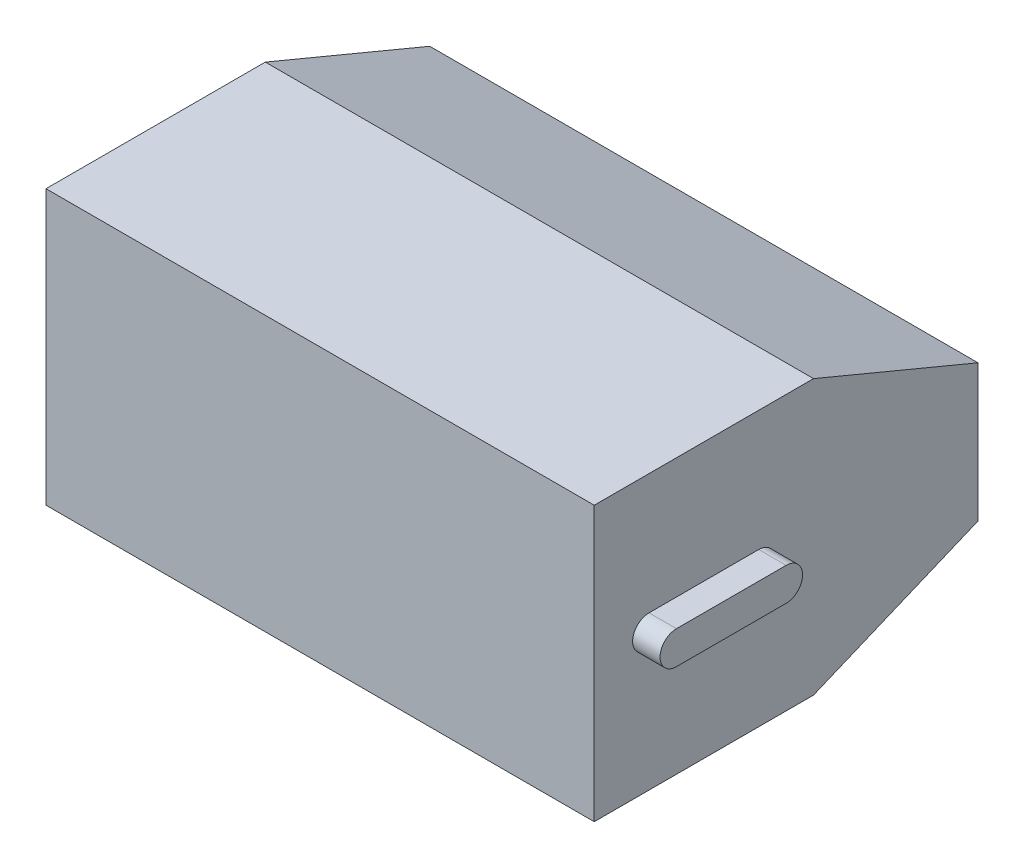
ISO-10303-21;
HEADER;
FILE_DESCRIPTION(('STEP AP214'),'2;1');
FILE_NAME('part.step','',(''),(''),'','','');
FILE_SCHEMA(('AUTOMOTIVE_DESIGN { 1 0 10303 214 1 1 1 1 }'));
ENDSEC;
DATA;
#1=APPLICATION_CONTEXT('core data for automotive mechanical design processes');
#2=APPLICATION_PROTOCOL_DEFINITION('international standard','automotive_design',2000,#1);
#3=PRODUCT_CONTEXT('',#1,'mechanical');
#4=PRODUCT('Part','Part','',(#3));
#5=PRODUCT_RELATED_PRODUCT_CATEGORY('part','',(#4));
#6=PRODUCT_DEFINITION_FORMATION('','',#4);
#7=PRODUCT_DEFINITION_CONTEXT('part definition',#1,'design');
#8=PRODUCT_DEFINITION('design','',#6,#7);
#9=PRODUCT_DEFINITION_SHAPE('','',#8);
#10=(LENGTH_UNIT() NAMED_UNIT(*) SI_UNIT(.MILLI.,.METRE.));
#11=(NAMED_UNIT(*) PLANE_ANGLE_UNIT() SI_UNIT($,.RADIAN.));
#12=(NAMED_UNIT(*) SI_UNIT($,.STERADIAN.) SOLID_ANGLE_UNIT());
#13=UNCERTAINTY_MEASURE_WITH_UNIT(LENGTH_MEASURE(1.E-05),#10,'distance_accuracy_value','');
#14=(GEOMETRIC_REPRESENTATION_CONTEXT(3) GLOBAL_UNCERTAINTY_ASSIGNED_CONTEXT((#13)) GLOBAL_UNIT_ASSIGNED_CONTEXT((#10,
#11,#12)) REPRESENTATION_CONTEXT('',''));
#15=CARTESIAN_POINT('',(0.,0.,0.));
#16=DIRECTION('',(0.,0.,1.));
#17=DIRECTION('',(1.,0.,0.));
#18=AXIS2_PLACEMENT_3D('',#15,#16,#17);
#19=CARTESIAN_POINT('',(50.,0.,0.));
#20=DIRECTION('',(1.,0.,0.));
#21=DIRECTION('',(0.,0.,-1.));
#22=AXIS2_PLACEMENT_3D('',#19,#20,#21);
#23=PLANE('',#22);
#24=DIRECTION('',(0.,0.384615384615389,-0.923076923076921));
#25=VECTOR('',#24,1.);
#26=CARTESIAN_POINT('',(50.,181.022440667378,177.070290746831));
#27=LINE('',#26,#25);
#28=CARTESIAN_POINT('',(50.,181.022440667378,177.070290746831));
#29=VERTEX_POINT('',#28);
#30=CARTESIAN_POINT('',(50.,193.522440667378,147.070290746831));
#31=VERTEX_POINT('',#30);
#32=EDGE_CURVE('E207',#29,#31,#27,.T.);
#33=ORIENTED_EDGE('',*,*,#32,.T.);
#34=DIRECTION('',(0.,1.,0.));
#35=VECTOR('',#34,1.);
#36=CARTESIAN_POINT('',(50.,193.522440667378,147.070290746831));
#37=LINE('',#36,#35);
#38=CARTESIAN_POINT('',(50.,218.522440667378,147.070290746831));
#39=VERTEX_POINT('',#38);
#40=EDGE_CURVE('E210',#31,#39,#37,.T.);
#41=ORIENTED_EDGE('',*,*,#40,.T.);
#42=DIRECTION('',(0.,0.384615384615377,0.923076923076926));
#43=VECTOR('',#42,1.);
#44=CARTESIAN_POINT('',(50.,218.522440667378,147.070290746831));
#45=LINE('',#44,#43);
#46=CARTESIAN_POINT('',(50.,231.022440667378,177.070290746831));
#47=VERTEX_POINT('',#46);
#48=EDGE_CURVE('E213',#39,#47,#45,.T.);
#49=ORIENTED_EDGE('',*,*,#48,.T.);
#50=DIRECTION('',(0.,0.,1.));
#51=VECTOR('',#50,1.);
#52=CARTESIAN_POINT('',(50.,231.022440667378,217.070290746831));
#53=LINE('',#52,#51);
#54=CARTESIAN_POINT('',(50.,231.022440667378,217.070290746831));
#55=VERTEX_POINT('',#54);
#56=EDGE_CURVE('E216',#47,#55,#53,.T.);
#57=ORIENTED_EDGE('',*,*,#56,.T.);
#58=DIRECTION('',(0.,-1.,0.));
#59=VECTOR('',#58,1.);
#60=CARTESIAN_POINT('',(50.,231.022440667378,217.070290746831));
#61=LINE('',#60,#59);
#62=CARTESIAN_POINT('',(50.,181.022440667378,217.070290746831));
#63=VERTEX_POINT('',#62);
#64=EDGE_CURVE('E219',#55,#63,#61,.T.);
#65=ORIENTED_EDGE('',*,*,#64,.T.);
#66=DIRECTION('',(0.,0.,-1.));
#67=VECTOR('',#66,1.);
#68=CARTESIAN_POINT('',(50.,181.022440667378,217.070290746831));
#69=LINE('',#68,#67);
#70=EDGE_CURVE('E222',#63,#29,#69,.T.);
#71=ORIENTED_EDGE('',*,*,#70,.T.);
#72=EDGE_LOOP('',(#33,#41,#49,#57,#65,#71));
#73=FACE_BOUND('',#72,.T.);
#74=DIRECTION('',(0.,0.,1.));
#75=VECTOR('',#74,1.);
#76=CARTESIAN_POINT('',(50.,203.022440667378,0.));
#77=LINE('',#76,#75);
#78=CARTESIAN_POINT('',(50.,203.022440667378,187.070290746831));
#79=VERTEX_POINT('',#78);
#80=CARTESIAN_POINT('',(50.,203.022440667378,207.070290746831));
#81=VERTEX_POINT('',#80);
#82=EDGE_CURVE('E60',#79,#81,#77,.T.);
#83=ORIENTED_EDGE('',*,*,#82,.T.);
#84=CARTESIAN_POINT('',(50.,206.022440667378,207.070290746831));
#85=DIRECTION('',(1.,0.,0.));
#86=DIRECTION('',(0.,0.,-1.));
#87=AXIS2_PLACEMENT_3D('',#84,#85,#86);
#88=CIRCLE('',#87,3.);
#89=CARTESIAN_POINT('',(50.,209.022440667378,207.070290746831));
#90=VERTEX_POINT('',#89);
#91=EDGE_CURVE('E174',#90,#81,#88,.T.);
#92=ORIENTED_EDGE('',*,*,#91,.F.);
#93=DIRECTION('',(0.,0.,-1.));
#94=VECTOR('',#93,1.);
#95=CARTESIAN_POINT('',(50.,209.022440667378,0.));
#96=LINE('',#95,#94);
#97=CARTESIAN_POINT('',(50.,209.022440667378,187.070290746831));
#98=VERTEX_POINT('',#97);
#99=EDGE_CURVE('E181',#90,#98,#96,.T.);
#100=ORIENTED_EDGE('',*,*,#99,.T.);
#101=CARTESIAN_POINT('',(50.,206.022440667378,187.070290746831));
#102=DIRECTION('',(1.,0.,0.));
#103=DIRECTION('',(0.,0.,-1.));
#104=AXIS2_PLACEMENT_3D('',#101,#102,#103);
#105=CIRCLE('',#104,3.);
#106=EDGE_CURVE('E193',#79,#98,#105,.T.);
#107=ORIENTED_EDGE('',*,*,#106,.F.);
#108=EDGE_LOOP('',(#83,#92,#100,#107));
#109=FACE_BOUND('',#108,.T.);
#110=ADVANCED_FACE('F35',(#73,#109),#23,.T.);
#111=CARTESIAN_POINT('',(-50.,181.022440667378,177.070290746831));
#112=DIRECTION('',(0.,-0.923076923076921,-0.384615384615389));
#113=DIRECTION('',(0.,0.384615384615389,-0.923076923076921));
#114=AXIS2_PLACEMENT_3D('',#111,#112,#113);
#115=PLANE('',#114);
#116=DIRECTION('',(1.,0.,0.));
#117=VECTOR('',#116,1.);
#118=CARTESIAN_POINT('',(-50.,193.522440667378,147.070290746831));
#119=LINE('',#118,#117);
#120=CARTESIAN_POINT('',(-50.,193.522440667378,147.070290746831));
#121=VERTEX_POINT('',#120);
#122=EDGE_CURVE('E39',#121,#31,#119,.T.);
#123=ORIENTED_EDGE('',*,*,#122,.T.);
#124=ORIENTED_EDGE('',*,*,#32,.F.);
#125=DIRECTION('',(1.,0.,0.));
#126=VECTOR('',#125,1.);
#127=CARTESIAN_POINT('',(-50.,181.022440667378,177.070290746831));
#128=LINE('',#127,#126);
#129=CARTESIAN_POINT('',(-50.,181.022440667378,177.070290746831));
#130=VERTEX_POINT('',#129);
#131=EDGE_CURVE('E11',#130,#29,#128,.T.);
#132=ORIENTED_EDGE('',*,*,#131,.F.);
#133=DIRECTION('',(0.,0.384615384615389,-0.923076923076921));
#134=VECTOR('',#133,1.);
#135=CARTESIAN_POINT('',(-50.,181.022440667378,177.070290746831));
#136=LINE('',#135,#134);
#137=EDGE_CURVE('E225',#130,#121,#136,.T.);
#138=ORIENTED_EDGE('',*,*,#137,.T.);
#139=EDGE_LOOP('',(#123,#124,#132,#138));
#140=FACE_BOUND('',#139,.T.);
#141=ADVANCED_FACE('F37',(#140),#115,.T.);
#142=CARTESIAN_POINT('',(-50.,181.022440667378,217.070290746831));
#143=DIRECTION('',(0.,-1.,0.));
#144=DIRECTION('',(0.,0.,-1.));
#145=AXIS2_PLACEMENT_3D('',#142,#143,#144);
#146=PLANE('',#145);
#147=ORIENTED_EDGE('',*,*,#131,.T.);
#148=ORIENTED_EDGE('',*,*,#70,.F.);
#149=DIRECTION('',(1.,0.,0.));
#150=VECTOR('',#149,1.);
#151=CARTESIAN_POINT('',(-50.,181.022440667378,217.070290746831));
#152=LINE('',#151,#150);
#153=CARTESIAN_POINT('',(-50.,181.022440667378,217.070290746831));
#154=VERTEX_POINT('',#153);
#155=EDGE_CURVE('E44',#154,#63,#152,.T.);
#156=ORIENTED_EDGE('',*,*,#155,.F.);
#157=DIRECTION('',(0.,0.,-1.));
#158=VECTOR('',#157,1.);
#159=CARTESIAN_POINT('',(-50.,181.022440667378,217.070290746831));
#160=LINE('',#159,#158);
#161=EDGE_CURVE('E240',#154,#130,#160,.T.);
#162=ORIENTED_EDGE('',*,*,#161,.T.);
#163=EDGE_LOOP('',(#147,#148,#156,#162));
#164=FACE_BOUND('',#163,.T.);
#165=ADVANCED_FACE('F260',(#164),#146,.T.);
#166=CARTESIAN_POINT('',(-50.,231.022440667378,217.070290746831));
#167=DIRECTION('',(0.,0.,1.));
#168=DIRECTION('',(1.,0.,0.));
#169=AXIS2_PLACEMENT_3D('',#166,#167,#168);
#170=PLANE('',#169);
#171=ORIENTED_EDGE('',*,*,#155,.T.);
#172=ORIENTED_EDGE('',*,*,#64,.F.);
#173=DIRECTION('',(1.,0.,0.));
#174=VECTOR('',#173,1.);
#175=CARTESIAN_POINT('',(-50.,231.022440667378,217.070290746831));
#176=LINE('',#175,#174);
#177=CARTESIAN_POINT('',(-50.,231.022440667378,217.070290746831));
#178=VERTEX_POINT('',#177);
#179=EDGE_CURVE('E244',#178,#55,#176,.T.);
#180=ORIENTED_EDGE('',*,*,#179,.F.);
#181=DIRECTION('',(0.,-1.,0.));
#182=VECTOR('',#181,1.);
#183=CARTESIAN_POINT('',(-50.,231.022440667378,217.070290746831));
#184=LINE('',#183,#182);
#185=EDGE_CURVE('E237',#178,#154,#184,.T.);
#186=ORIENTED_EDGE('',*,*,#185,.T.);
#187=EDGE_LOOP('',(#171,#172,#180,#186));
#188=FACE_BOUND('',#187,.T.);
#189=ADVANCED_FACE('F273',(#188),#170,.T.);
#190=CARTESIAN_POINT('',(-50.,231.022440667378,217.070290746831));
#191=DIRECTION('',(0.,1.,0.));
#192=DIRECTION('',(0.,0.,1.));
#193=AXIS2_PLACEMENT_3D('',#190,#191,#192);
#194=PLANE('',#193);
#195=ORIENTED_EDGE('',*,*,#179,.T.);
#196=ORIENTED_EDGE('',*,*,#56,.F.);
#197=DIRECTION('',(1.,0.,0.));
#198=VECTOR('',#197,1.);
#199=CARTESIAN_POINT('',(-50.,231.022440667378,177.070290746831));
#200=LINE('',#199,#198);
#201=CARTESIAN_POINT('',(-50.,231.022440667378,177.070290746831));
#202=VERTEX_POINT('',#201);
#203=EDGE_CURVE('E246',#202,#47,#200,.T.);
#204=ORIENTED_EDGE('',*,*,#203,.F.);
#205=DIRECTION('',(0.,0.,1.));
#206=VECTOR('',#205,1.);
#207=CARTESIAN_POINT('',(-50.,231.022440667378,217.070290746831));
#208=LINE('',#207,#206);
#209=EDGE_CURVE('E234',#202,#178,#208,.T.);
#210=ORIENTED_EDGE('',*,*,#209,.T.);
#211=EDGE_LOOP('',(#195,#196,#204,#210));
#212=FACE_BOUND('',#211,.T.);
#213=ADVANCED_FACE('F271',(#212),#194,.T.);
#214=CARTESIAN_POINT('',(-50.,218.522440667378,147.070290746831));
#215=DIRECTION('',(0.,0.923076923076926,-0.384615384615377));
#216=DIRECTION('',(0.,0.384615384615377,0.923076923076926));
#217=AXIS2_PLACEMENT_3D('',#214,#215,#216);
#218=PLANE('',#217);
#219=ORIENTED_EDGE('',*,*,#203,.T.);
#220=ORIENTED_EDGE('',*,*,#48,.F.);
#221=DIRECTION('',(1.,0.,0.));
#222=VECTOR('',#221,1.);
#223=CARTESIAN_POINT('',(-50.,218.522440667378,147.070290746831));
#224=LINE('',#223,#222);
#225=CARTESIAN_POINT('',(-50.,218.522440667378,147.070290746831));
#226=VERTEX_POINT('',#225);
#227=EDGE_CURVE('E247',#226,#39,#224,.T.);
#228=ORIENTED_EDGE('',*,*,#227,.F.);
#229=DIRECTION('',(0.,0.384615384615377,0.923076923076926));
#230=VECTOR('',#229,1.);
#231=CARTESIAN_POINT('',(-50.,218.522440667378,147.070290746831));
#232=LINE('',#231,#230);
#233=EDGE_CURVE('E231',#226,#202,#232,.T.);
#234=ORIENTED_EDGE('',*,*,#233,.T.);
#235=EDGE_LOOP('',(#219,#220,#228,#234));
#236=FACE_BOUND('',#235,.T.);
#237=ADVANCED_FACE('F268',(#236),#218,.T.);
#238=CARTESIAN_POINT('',(-50.,193.522440667378,147.070290746831));
#239=DIRECTION('',(0.,0.,-1.));
#240=DIRECTION('',(-1.,0.,0.));
#241=AXIS2_PLACEMENT_3D('',#238,#239,#240);
#242=PLANE('',#241);
#243=ORIENTED_EDGE('',*,*,#227,.T.);
#244=ORIENTED_EDGE('',*,*,#40,.F.);
#245=ORIENTED_EDGE('',*,*,#122,.F.);
#246=DIRECTION('',(0.,1.,0.));
#247=VECTOR('',#246,1.);
#248=CARTESIAN_POINT('',(-50.,193.522440667378,147.070290746831));
#249=LINE('',#248,#247);
#250=EDGE_CURVE('E228',#121,#226,#249,.T.);
#251=ORIENTED_EDGE('',*,*,#250,.T.);
#252=EDGE_LOOP('',(#243,#244,#245,#251));
#253=FACE_BOUND('',#252,.T.);
#254=ADVANCED_FACE('F254',(#253),#242,.T.);
#255=CARTESIAN_POINT('',(-50.,0.,0.));
#256=DIRECTION('',(1.,0.,0.));
#257=DIRECTION('',(0.,0.,-1.));
#258=AXIS2_PLACEMENT_3D('',#255,#256,#257);
#259=PLANE('',#258);
#260=CARTESIAN_POINT('',(-50.,206.022440667378,207.070290746831));
#261=DIRECTION('',(1.,0.,0.));
#262=DIRECTION('',(0.,0.,-1.));
#263=AXIS2_PLACEMENT_3D('',#260,#261,#262);
#264=CIRCLE('',#263,3.);
#265=CARTESIAN_POINT('',(-50.,209.022440667378,207.070290746831));
#266=VERTEX_POINT('',#265);
#267=CARTESIAN_POINT('',(-50.,203.022440667378,207.070290746831));
#268=VERTEX_POINT('',#267);
#269=EDGE_CURVE('E162',#266,#268,#264,.T.);
#270=ORIENTED_EDGE('',*,*,#269,.T.);
#271=DIRECTION('',(0.,0.,-1.));
#272=VECTOR('',#271,1.);
#273=CARTESIAN_POINT('',(-50.,203.022440667378,0.));
#274=LINE('',#273,#272);
#275=CARTESIAN_POINT('',(-50.,203.022440667378,187.070290746831));
#276=VERTEX_POINT('',#275);
#277=EDGE_CURVE('E169',#268,#276,#274,.T.);
#278=ORIENTED_EDGE('',*,*,#277,.T.);
#279=CARTESIAN_POINT('',(-50.,206.022440667378,187.070290746831));
#280=DIRECTION('',(1.,0.,0.));
#281=DIRECTION('',(0.,0.,-1.));
#282=AXIS2_PLACEMENT_3D('',#279,#280,#281);
#283=CIRCLE('',#282,3.);
#284=CARTESIAN_POINT('',(-50.,209.022440667378,187.070290746831));
#285=VERTEX_POINT('',#284);
#286=EDGE_CURVE('E142',#276,#285,#283,.T.);
#287=ORIENTED_EDGE('',*,*,#286,.T.);
#288=DIRECTION('',(0.,0.,1.));
#289=VECTOR('',#288,1.);
#290=CARTESIAN_POINT('',(-50.,209.022440667378,0.));
#291=LINE('',#290,#289);
#292=EDGE_CURVE('E52',#285,#266,#291,.T.);
#293=ORIENTED_EDGE('',*,*,#292,.T.);
#294=EDGE_LOOP('',(#270,#278,#287,#293));
#295=FACE_BOUND('',#294,.T.);
#296=ORIENTED_EDGE('',*,*,#137,.F.);
#297=ORIENTED_EDGE('',*,*,#161,.F.);
#298=ORIENTED_EDGE('',*,*,#185,.F.);
#299=ORIENTED_EDGE('',*,*,#209,.F.);
#300=ORIENTED_EDGE('',*,*,#233,.F.);
#301=ORIENTED_EDGE('',*,*,#250,.F.);
#302=EDGE_LOOP('',(#296,#297,#298,#299,#300,#301));
#303=FACE_BOUND('',#302,.T.);
#304=ADVANCED_FACE('F263',(#295,#303),#259,.F.);
#305=CARTESIAN_POINT('',(55.,206.022440667378,207.070290746831));
#306=DIRECTION('',(-1.,0.,0.));
#307=DIRECTION('',(0.,0.,1.));
#308=AXIS2_PLACEMENT_3D('',#305,#306,#307);
#309=CYLINDRICAL_SURFACE('',#308,3.);
#310=ORIENTED_EDGE('',*,*,#91,.T.);
#311=DIRECTION('',(-1.,0.,0.));
#312=VECTOR('',#311,1.);
#313=CARTESIAN_POINT('',(55.,203.022440667378,207.070290746831));
#314=LINE('',#313,#312);
#315=CARTESIAN_POINT('',(55.,203.022440667378,207.070290746831));
#316=VERTEX_POINT('',#315);
#317=EDGE_CURVE('E205',#316,#81,#314,.T.);
#318=ORIENTED_EDGE('',*,*,#317,.F.);
#319=CARTESIAN_POINT('',(55.,206.022440667378,207.070290746831));
#320=DIRECTION('',(1.,0.,0.));
#321=DIRECTION('',(0.,0.,-1.));
#322=AXIS2_PLACEMENT_3D('',#319,#320,#321);
#323=CIRCLE('',#322,3.);
#324=CARTESIAN_POINT('',(55.,209.022440667378,207.070290746831));
#325=VERTEX_POINT('',#324);
#326=EDGE_CURVE('E178',#325,#316,#323,.T.);
#327=ORIENTED_EDGE('',*,*,#326,.F.);
#328=DIRECTION('',(-1.,0.,0.));
#329=VECTOR('',#328,1.);
#330=CARTESIAN_POINT('',(55.,209.022440667378,207.070290746831));
#331=LINE('',#330,#329);
#332=EDGE_CURVE('E189',#325,#90,#331,.T.);
#333=ORIENTED_EDGE('',*,*,#332,.T.);
#334=EDGE_LOOP('',(#310,#318,#327,#333));
#335=FACE_BOUND('',#334,.T.);
#336=ADVANCED_FACE('F289',(#335),#309,.T.);
#337=CARTESIAN_POINT('',(55.,203.022440667378,0.));
#338=DIRECTION('',(0.,-1.,0.));
#339=DIRECTION('',(0.,0.,-1.));
#340=AXIS2_PLACEMENT_3D('',#337,#338,#339);
#341=PLANE('',#340);
#342=ORIENTED_EDGE('',*,*,#82,.F.);
#343=DIRECTION('',(-1.,0.,0.));
#344=VECTOR('',#343,1.);
#345=CARTESIAN_POINT('',(55.,203.022440667378,187.070290746831));
#346=LINE('',#345,#344);
#347=CARTESIAN_POINT('',(55.,203.022440667378,187.070290746831));
#348=VERTEX_POINT('',#347);
#349=EDGE_CURVE('E202',#348,#79,#346,.T.);
#350=ORIENTED_EDGE('',*,*,#349,.F.);
#351=DIRECTION('',(0.,0.,1.));
#352=VECTOR('',#351,1.);
#353=CARTESIAN_POINT('',(55.,203.022440667378,0.));
#354=LINE('',#353,#352);
#355=EDGE_CURVE('E180',#348,#316,#354,.T.);
#356=ORIENTED_EDGE('',*,*,#355,.T.);
#357=ORIENTED_EDGE('',*,*,#317,.T.);
#358=EDGE_LOOP('',(#342,#350,#356,#357));
#359=FACE_BOUND('',#358,.T.);
#360=ADVANCED_FACE('F297',(#359),#341,.T.);
#361=CARTESIAN_POINT('',(55.,206.022440667378,187.070290746831));
#362=DIRECTION('',(-1.,0.,0.));
#363=DIRECTION('',(0.,0.,1.));
#364=AXIS2_PLACEMENT_3D('',#361,#362,#363);
#365=CYLINDRICAL_SURFACE('',#364,3.);
#366=ORIENTED_EDGE('',*,*,#106,.T.);
#367=DIRECTION('',(-1.,0.,0.));
#368=VECTOR('',#367,1.);
#369=CARTESIAN_POINT('',(55.,209.022440667378,187.070290746831));
#370=LINE('',#369,#368);
#371=CARTESIAN_POINT('',(55.,209.022440667378,187.070290746831));
#372=VERTEX_POINT('',#371);
#373=EDGE_CURVE('E199',#372,#98,#370,.T.);
#374=ORIENTED_EDGE('',*,*,#373,.F.);
#375=CARTESIAN_POINT('',(55.,206.022440667378,187.070290746831));
#376=DIRECTION('',(1.,0.,0.));
#377=DIRECTION('',(0.,0.,-1.));
#378=AXIS2_PLACEMENT_3D('',#375,#376,#377);
#379=CIRCLE('',#378,3.);
#380=EDGE_CURVE('E184',#348,#372,#379,.T.);
#381=ORIENTED_EDGE('',*,*,#380,.F.);
#382=ORIENTED_EDGE('',*,*,#349,.T.);
#383=EDGE_LOOP('',(#366,#374,#381,#382));
#384=FACE_BOUND('',#383,.T.);
#385=ADVANCED_FACE('F322',(#384),#365,.T.);
#386=CARTESIAN_POINT('',(55.,209.022440667378,0.));
#387=DIRECTION('',(0.,1.,0.));
#388=DIRECTION('',(0.,0.,1.));
#389=AXIS2_PLACEMENT_3D('',#386,#387,#388);
#390=PLANE('',#389);
#391=ORIENTED_EDGE('',*,*,#99,.F.);
#392=ORIENTED_EDGE('',*,*,#332,.F.);
#393=DIRECTION('',(0.,0.,-1.));
#394=VECTOR('',#393,1.);
#395=CARTESIAN_POINT('',(55.,209.022440667378,0.));
#396=LINE('',#395,#394);
#397=EDGE_CURVE('E186',#325,#372,#396,.T.);
#398=ORIENTED_EDGE('',*,*,#397,.T.);
#399=ORIENTED_EDGE('',*,*,#373,.T.);
#400=EDGE_LOOP('',(#391,#392,#398,#399));
#401=FACE_BOUND('',#400,.T.);
#402=ADVANCED_FACE('F318',(#401),#390,.T.);
#403=CARTESIAN_POINT('',(55.,206.022440667378,207.070290746831));
#404=DIRECTION('',(1.,0.,0.));
#405=DIRECTION('',(0.,0.,-1.));
#406=AXIS2_PLACEMENT_3D('',#403,#404,#405);
#407=PLANE('',#406);
#408=ORIENTED_EDGE('',*,*,#326,.T.);
#409=ORIENTED_EDGE('',*,*,#355,.F.);
#410=ORIENTED_EDGE('',*,*,#380,.T.);
#411=ORIENTED_EDGE('',*,*,#397,.F.);
#412=EDGE_LOOP('',(#408,#409,#410,#411));
#413=FACE_BOUND('',#412,.T.);
#414=ADVANCED_FACE('F315',(#413),#407,.T.);
#415=CARTESIAN_POINT('',(-55.,203.022440667378,0.));
#416=DIRECTION('',(0.,-1.,0.));
#417=DIRECTION('',(0.,0.,-1.));
#418=AXIS2_PLACEMENT_3D('',#415,#416,#417);
#419=PLANE('',#418);
#420=ORIENTED_EDGE('',*,*,#277,.F.);
#421=DIRECTION('',(1.,0.,0.));
#422=VECTOR('',#421,1.);
#423=CARTESIAN_POINT('',(-55.,203.022440667378,207.070290746831));
#424=LINE('',#423,#422);
#425=CARTESIAN_POINT('',(-55.,203.022440667378,207.070290746831));
#426=VERTEX_POINT('',#425);
#427=EDGE_CURVE('E161',#426,#268,#424,.T.);
#428=ORIENTED_EDGE('',*,*,#427,.F.);
#429=DIRECTION('',(0.,0.,-1.));
#430=VECTOR('',#429,1.);
#431=CARTESIAN_POINT('',(-55.,203.022440667378,0.));
#432=LINE('',#431,#430);
#433=CARTESIAN_POINT('',(-55.,203.022440667378,187.070290746831));
#434=VERTEX_POINT('',#433);
#435=EDGE_CURVE('E155',#426,#434,#432,.T.);
#436=ORIENTED_EDGE('',*,*,#435,.T.);
#437=DIRECTION('',(1.,0.,0.));
#438=VECTOR('',#437,1.);
#439=CARTESIAN_POINT('',(-55.,203.022440667378,187.070290746831));
#440=LINE('',#439,#438);
#441=EDGE_CURVE('E137',#434,#276,#440,.T.);
#442=ORIENTED_EDGE('',*,*,#441,.T.);
#443=EDGE_LOOP('',(#420,#428,#436,#442));
#444=FACE_BOUND('',#443,.T.);
#445=ADVANCED_FACE('F160',(#444),#419,.T.);
#446=CARTESIAN_POINT('',(-55.,206.022440667378,207.070290746831));
#447=DIRECTION('',(1.,0.,0.));
#448=DIRECTION('',(0.,0.,-1.));
#449=AXIS2_PLACEMENT_3D('',#446,#447,#448);
#450=CYLINDRICAL_SURFACE('',#449,3.);
#451=ORIENTED_EDGE('',*,*,#269,.F.);
#452=DIRECTION('',(1.,0.,0.));
#453=VECTOR('',#452,1.);
#454=CARTESIAN_POINT('',(-55.,209.022440667378,207.070290746831));
#455=LINE('',#454,#453);
#456=CARTESIAN_POINT('',(-55.,209.022440667378,207.070290746831));
#457=VERTEX_POINT('',#456);
#458=EDGE_CURVE('E175',#457,#266,#455,.T.);
#459=ORIENTED_EDGE('',*,*,#458,.F.);
#460=CARTESIAN_POINT('',(-55.,206.022440667378,207.070290746831));
#461=DIRECTION('',(1.,0.,0.));
#462=DIRECTION('',(0.,0.,-1.));
#463=AXIS2_PLACEMENT_3D('',#460,#461,#462);
#464=CIRCLE('',#463,3.);
#465=EDGE_CURVE('E148',#457,#426,#464,.T.);
#466=ORIENTED_EDGE('',*,*,#465,.T.);
#467=ORIENTED_EDGE('',*,*,#427,.T.);
#468=EDGE_LOOP('',(#451,#459,#466,#467));
#469=FACE_BOUND('',#468,.T.);
#470=ADVANCED_FACE('F301',(#469),#450,.T.);
#471=CARTESIAN_POINT('',(-55.,209.022440667378,0.));
#472=DIRECTION('',(0.,1.,0.));
#473=DIRECTION('',(0.,0.,1.));
#474=AXIS2_PLACEMENT_3D('',#471,#472,#473);
#475=PLANE('',#474);
#476=ORIENTED_EDGE('',*,*,#292,.F.);
#477=DIRECTION('',(1.,0.,0.));
#478=VECTOR('',#477,1.);
#479=CARTESIAN_POINT('',(-55.,209.022440667378,187.070290746831));
#480=LINE('',#479,#478);
#481=CARTESIAN_POINT('',(-55.,209.022440667378,187.070290746831));
#482=VERTEX_POINT('',#481);
#483=EDGE_CURVE('E147',#482,#285,#480,.T.);
#484=ORIENTED_EDGE('',*,*,#483,.F.);
#485=DIRECTION('',(0.,0.,1.));
#486=VECTOR('',#485,1.);
#487=CARTESIAN_POINT('',(-55.,209.022440667378,0.));
#488=LINE('',#487,#486);
#489=EDGE_CURVE('E158',#482,#457,#488,.T.);
#490=ORIENTED_EDGE('',*,*,#489,.T.);
#491=ORIENTED_EDGE('',*,*,#458,.T.);
#492=EDGE_LOOP('',(#476,#484,#490,#491));
#493=FACE_BOUND('',#492,.T.);
#494=ADVANCED_FACE('F302',(#493),#475,.T.);
#495=CARTESIAN_POINT('',(-55.,206.022440667378,187.070290746831));
#496=DIRECTION('',(1.,0.,0.));
#497=DIRECTION('',(0.,0.,-1.));
#498=AXIS2_PLACEMENT_3D('',#495,#496,#497);
#499=CYLINDRICAL_SURFACE('',#498,3.);
#500=ORIENTED_EDGE('',*,*,#286,.F.);
#501=ORIENTED_EDGE('',*,*,#441,.F.);
#502=CARTESIAN_POINT('',(-55.,206.022440667378,187.070290746831));
#503=DIRECTION('',(1.,0.,0.));
#504=DIRECTION('',(0.,0.,-1.));
#505=AXIS2_PLACEMENT_3D('',#502,#503,#504);
#506=CIRCLE('',#505,3.);
#507=EDGE_CURVE('E140',#434,#482,#506,.T.);
#508=ORIENTED_EDGE('',*,*,#507,.T.);
#509=ORIENTED_EDGE('',*,*,#483,.T.);
#510=EDGE_LOOP('',(#500,#501,#508,#509));
#511=FACE_BOUND('',#510,.T.);
#512=ADVANCED_FACE('F139',(#511),#499,.T.);
#513=CARTESIAN_POINT('',(-55.,206.022440667378,187.070290746831));
#514=DIRECTION('',(1.,0.,0.));
#515=DIRECTION('',(0.,0.,-1.));
#516=AXIS2_PLACEMENT_3D('',#513,#514,#515);
#517=PLANE('',#516);
#518=ORIENTED_EDGE('',*,*,#435,.F.);
#519=ORIENTED_EDGE('',*,*,#465,.F.);
#520=ORIENTED_EDGE('',*,*,#489,.F.);
#521=ORIENTED_EDGE('',*,*,#507,.F.);
#522=EDGE_LOOP('',(#518,#519,#520,#521));
#523=FACE_BOUND('',#522,.T.);
#524=ADVANCED_FACE('F153',(#523),#517,.F.);
#525=CLOSED_SHELL('',(#110,#141,#165,#189,#213,#237,#254,#304,#336,#360,#385,#402,#414,#445,
#470,#494,#512,#524));
#526=MANIFOLD_SOLID_BREP('B2',#525);
#527=ADVANCED_BREP_SHAPE_REPRESENTATION('',(#18,#526),#14);
#528=SHAPE_DEFINITION_REPRESENTATION(#9,#527);
ENDSEC;
END-ISO-10303-21;
